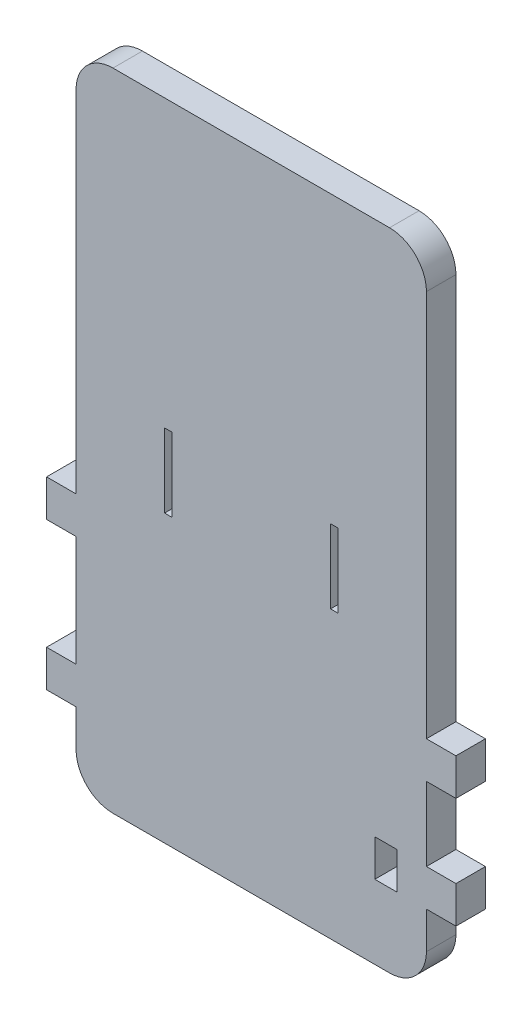
ISO-10303-21;
HEADER;
FILE_DESCRIPTION(('STEP AP214'),'2;1');
FILE_NAME('part.step','',(''),(''),'','','');
FILE_SCHEMA(('AUTOMOTIVE_DESIGN { 1 0 10303 214 1 1 1 1 }'));
ENDSEC;
DATA;
#1=APPLICATION_CONTEXT('core data for automotive mechanical design processes');
#2=APPLICATION_PROTOCOL_DEFINITION('international standard','automotive_design',2000,#1);
#3=PRODUCT_CONTEXT('',#1,'mechanical');
#4=PRODUCT('Part','Part','',(#3));
#5=PRODUCT_RELATED_PRODUCT_CATEGORY('part','',(#4));
#6=PRODUCT_DEFINITION_FORMATION('','',#4);
#7=PRODUCT_DEFINITION_CONTEXT('part definition',#1,'design');
#8=PRODUCT_DEFINITION('design','',#6,#7);
#9=PRODUCT_DEFINITION_SHAPE('','',#8);
#10=(LENGTH_UNIT() NAMED_UNIT(*) SI_UNIT(.MILLI.,.METRE.));
#11=(NAMED_UNIT(*) PLANE_ANGLE_UNIT() SI_UNIT($,.RADIAN.));
#12=(NAMED_UNIT(*) SI_UNIT($,.STERADIAN.) SOLID_ANGLE_UNIT());
#13=UNCERTAINTY_MEASURE_WITH_UNIT(LENGTH_MEASURE(1.E-05),#10,'distance_accuracy_value','');
#14=(GEOMETRIC_REPRESENTATION_CONTEXT(3) GLOBAL_UNCERTAINTY_ASSIGNED_CONTEXT((#13)) GLOBAL_UNIT_ASSIGNED_CONTEXT((#10,
#11,#12)) REPRESENTATION_CONTEXT('',''));
#15=CARTESIAN_POINT('',(0.,0.,0.));
#16=DIRECTION('',(0.,0.,1.));
#17=DIRECTION('',(1.,0.,0.));
#18=AXIS2_PLACEMENT_3D('',#15,#16,#17);
#19=CARTESIAN_POINT('',(47.5,0.,8.));
#20=DIRECTION('',(-1.,0.,0.));
#21=DIRECTION('',(0.,0.,1.));
#22=AXIS2_PLACEMENT_3D('',#19,#20,#21);
#23=PLANE('',#22);
#24=DIRECTION('',(0.,0.,-1.));
#25=VECTOR('',#24,1.);
#26=CARTESIAN_POINT('',(47.5,-37.5,8.0000000000001));
#27=LINE('',#26,#25);
#28=CARTESIAN_POINT('',(47.5,-37.5,8.));
#29=VERTEX_POINT('',#28);
#30=CARTESIAN_POINT('',(47.5,-37.5,0.));
#31=VERTEX_POINT('',#30);
#32=EDGE_CURVE('E60',#29,#31,#27,.T.);
#33=ORIENTED_EDGE('',*,*,#32,.F.);
#34=DIRECTION('',(0.,1.,0.));
#35=VECTOR('',#34,1.);
#36=CARTESIAN_POINT('',(47.5,0.,8.));
#37=LINE('',#36,#35);
#38=CARTESIAN_POINT('',(47.5,-57.5,8.));
#39=VERTEX_POINT('',#38);
#40=EDGE_CURVE('E295',#39,#29,#37,.T.);
#41=ORIENTED_EDGE('',*,*,#40,.F.);
#42=DIRECTION('',(0.,0.,1.));
#43=VECTOR('',#42,1.);
#44=CARTESIAN_POINT('',(47.5,-57.5,8.));
#45=LINE('',#44,#43);
#46=CARTESIAN_POINT('',(47.5,-57.5,0.));
#47=VERTEX_POINT('',#46);
#48=EDGE_CURVE('E299',#47,#39,#45,.T.);
#49=ORIENTED_EDGE('',*,*,#48,.F.);
#50=DIRECTION('',(0.,1.,0.));
#51=VECTOR('',#50,1.);
#52=CARTESIAN_POINT('',(47.5,0.,0.));
#53=LINE('',#52,#51);
#54=EDGE_CURVE('E457',#47,#31,#53,.T.);
#55=ORIENTED_EDGE('',*,*,#54,.T.);
#56=EDGE_LOOP('',(#33,#41,#49,#55));
#57=FACE_BOUND('',#56,.T.);
#58=ADVANCED_FACE('F35',(#57),#23,.F.);
#59=DIRECTION('',(0.,0.,1.));
#60=VECTOR('',#59,1.);
#61=CARTESIAN_POINT('',(47.5,-27.5,8.0000000000001));
#62=LINE('',#61,#60);
#63=CARTESIAN_POINT('',(47.5,-27.5,1.04744440165294E-13));
#64=VERTEX_POINT('',#63);
#65=CARTESIAN_POINT('',(47.5,-27.5,8.));
#66=VERTEX_POINT('',#65);
#67=EDGE_CURVE('E289',#64,#66,#62,.T.);
#68=ORIENTED_EDGE('',*,*,#67,.F.);
#69=CARTESIAN_POINT('',(47.5,77.4999999999999,0.));
#70=VERTEX_POINT('',#69);
#71=EDGE_CURVE('E453',#64,#70,#53,.T.);
#72=ORIENTED_EDGE('',*,*,#71,.T.);
#73=DIRECTION('',(0.,0.,-1.));
#74=VECTOR('',#73,1.);
#75=CARTESIAN_POINT('',(47.5,77.4999999999999,8.));
#76=LINE('',#75,#74);
#77=CARTESIAN_POINT('',(47.5,77.4999999999999,8.));
#78=VERTEX_POINT('',#77);
#79=EDGE_CURVE('E432',#78,#70,#76,.T.);
#80=ORIENTED_EDGE('',*,*,#79,.F.);
#81=EDGE_CURVE('E52',#66,#78,#37,.T.);
#82=ORIENTED_EDGE('',*,*,#81,.F.);
#83=EDGE_LOOP('',(#68,#72,#80,#82));
#84=FACE_BOUND('',#83,.T.);
#85=ADVANCED_FACE('F550',(#84),#23,.F.);
#86=DIRECTION('',(0.,0.,-1.));
#87=VECTOR('',#86,1.);
#88=CARTESIAN_POINT('',(47.5,-67.5,8.));
#89=LINE('',#88,#87);
#90=CARTESIAN_POINT('',(47.5,-67.5,8.));
#91=VERTEX_POINT('',#90);
#92=CARTESIAN_POINT('',(47.5,-67.5,0.));
#93=VERTEX_POINT('',#92);
#94=EDGE_CURVE('E296',#91,#93,#89,.T.);
#95=ORIENTED_EDGE('',*,*,#94,.F.);
#96=CARTESIAN_POINT('',(47.5,-77.4999999999999,8.));
#97=VERTEX_POINT('',#96);
#98=EDGE_CURVE('E396',#97,#91,#37,.T.);
#99=ORIENTED_EDGE('',*,*,#98,.F.);
#100=DIRECTION('',(0.,0.,-1.));
#101=VECTOR('',#100,1.);
#102=CARTESIAN_POINT('',(47.5,-77.4999999999999,8.));
#103=LINE('',#102,#101);
#104=CARTESIAN_POINT('',(47.5,-77.4999999999999,0.));
#105=VERTEX_POINT('',#104);
#106=EDGE_CURVE('E518',#97,#105,#103,.T.);
#107=ORIENTED_EDGE('',*,*,#106,.T.);
#108=EDGE_CURVE('E454',#105,#93,#53,.T.);
#109=ORIENTED_EDGE('',*,*,#108,.T.);
#110=EDGE_LOOP('',(#95,#99,#107,#109));
#111=FACE_BOUND('',#110,.T.);
#112=ADVANCED_FACE('F573',(#111),#23,.F.);
#113=CARTESIAN_POINT('',(-47.5,0.,8.));
#114=DIRECTION('',(-1.,0.,0.));
#115=DIRECTION('',(0.,0.,1.));
#116=AXIS2_PLACEMENT_3D('',#113,#114,#115);
#117=PLANE('',#116);
#118=DIRECTION('',(0.,1.,0.));
#119=VECTOR('',#118,1.);
#120=CARTESIAN_POINT('',(-47.5,0.,8.));
#121=LINE('',#120,#119);
#122=CARTESIAN_POINT('',(-47.5,-57.5,8.00000000000002));
#123=VERTEX_POINT('',#122);
#124=CARTESIAN_POINT('',(-47.5,-27.5,8.));
#125=VERTEX_POINT('',#124);
#126=EDGE_CURVE('E389',#123,#125,#121,.T.);
#127=ORIENTED_EDGE('',*,*,#126,.T.);
#128=DIRECTION('',(0.,0.,1.));
#129=VECTOR('',#128,1.);
#130=CARTESIAN_POINT('',(-47.5,-27.5,0.));
#131=LINE('',#130,#129);
#132=CARTESIAN_POINT('',(-47.5,-27.5,0.));
#133=VERTEX_POINT('',#132);
#134=EDGE_CURVE('E327',#133,#125,#131,.T.);
#135=ORIENTED_EDGE('',*,*,#134,.F.);
#136=DIRECTION('',(0.,1.,0.));
#137=VECTOR('',#136,1.);
#138=CARTESIAN_POINT('',(-47.5,0.,0.));
#139=LINE('',#138,#137);
#140=CARTESIAN_POINT('',(-47.5,-57.5,0.));
#141=VERTEX_POINT('',#140);
#142=EDGE_CURVE('E446',#141,#133,#139,.T.);
#143=ORIENTED_EDGE('',*,*,#142,.F.);
#144=DIRECTION('',(0.,0.,-1.));
#145=VECTOR('',#144,1.);
#146=CARTESIAN_POINT('',(-47.5,-57.5,0.));
#147=LINE('',#146,#145);
#148=EDGE_CURVE('E355',#123,#141,#147,.T.);
#149=ORIENTED_EDGE('',*,*,#148,.F.);
#150=EDGE_LOOP('',(#127,#135,#143,#149));
#151=FACE_BOUND('',#150,.T.);
#152=ADVANCED_FACE('F580',(#151),#117,.T.);
#153=CARTESIAN_POINT('',(-47.5,-17.5,0.));
#154=VERTEX_POINT('',#153);
#155=CARTESIAN_POINT('',(-47.5,77.4999999999999,0.));
#156=VERTEX_POINT('',#155);
#157=EDGE_CURVE('E441',#154,#156,#139,.T.);
#158=ORIENTED_EDGE('',*,*,#157,.F.);
#159=DIRECTION('',(0.,0.,-1.));
#160=VECTOR('',#159,1.);
#161=CARTESIAN_POINT('',(-47.5,-17.5,0.));
#162=LINE('',#161,#160);
#163=CARTESIAN_POINT('',(-47.5,-17.5,8.));
#164=VERTEX_POINT('',#163);
#165=EDGE_CURVE('E332',#164,#154,#162,.T.);
#166=ORIENTED_EDGE('',*,*,#165,.F.);
#167=CARTESIAN_POINT('',(-47.5,77.4999999999999,8.));
#168=VERTEX_POINT('',#167);
#169=EDGE_CURVE('E384',#164,#168,#121,.T.);
#170=ORIENTED_EDGE('',*,*,#169,.T.);
#171=DIRECTION('',(0.,0.,-1.));
#172=VECTOR('',#171,1.);
#173=CARTESIAN_POINT('',(-47.5,77.4999999999999,8.));
#174=LINE('',#173,#172);
#175=EDGE_CURVE('E528',#168,#156,#174,.T.);
#176=ORIENTED_EDGE('',*,*,#175,.T.);
#177=EDGE_LOOP('',(#158,#166,#170,#176));
#178=FACE_BOUND('',#177,.T.);
#179=ADVANCED_FACE('F585',(#178),#117,.T.);
#180=CARTESIAN_POINT('',(-47.5,-77.4999999999999,8.));
#181=VERTEX_POINT('',#180);
#182=CARTESIAN_POINT('',(-47.5,-67.5,8.));
#183=VERTEX_POINT('',#182);
#184=EDGE_CURVE('E385',#181,#183,#121,.T.);
#185=ORIENTED_EDGE('',*,*,#184,.T.);
#186=DIRECTION('',(0.,0.,1.));
#187=VECTOR('',#186,1.);
#188=CARTESIAN_POINT('',(-47.5,-67.5,0.));
#189=LINE('',#188,#187);
#190=CARTESIAN_POINT('',(-47.5,-67.5,0.));
#191=VERTEX_POINT('',#190);
#192=EDGE_CURVE('E350',#191,#183,#189,.T.);
#193=ORIENTED_EDGE('',*,*,#192,.F.);
#194=CARTESIAN_POINT('',(-47.5,-77.4999999999999,0.));
#195=VERTEX_POINT('',#194);
#196=EDGE_CURVE('E442',#195,#191,#139,.T.);
#197=ORIENTED_EDGE('',*,*,#196,.F.);
#198=DIRECTION('',(0.,0.,-1.));
#199=VECTOR('',#198,1.);
#200=CARTESIAN_POINT('',(-47.5,-77.4999999999999,8.));
#201=LINE('',#200,#199);
#202=EDGE_CURVE('E526',#181,#195,#201,.T.);
#203=ORIENTED_EDGE('',*,*,#202,.F.);
#204=EDGE_LOOP('',(#185,#193,#197,#203));
#205=FACE_BOUND('',#204,.T.);
#206=ADVANCED_FACE('F588',(#205),#117,.T.);
#207=CARTESIAN_POINT('',(23.5,0.,8.));
#208=DIRECTION('',(-1.,0.,0.));
#209=DIRECTION('',(0.,0.,1.));
#210=AXIS2_PLACEMENT_3D('',#207,#208,#209);
#211=PLANE('',#210);
#212=DIRECTION('',(0.,1.,0.));
#213=VECTOR('',#212,1.);
#214=CARTESIAN_POINT('',(23.5,0.,0.));
#215=LINE('',#214,#213);
#216=CARTESIAN_POINT('',(23.5,-9.99999999999998,0.));
#217=VERTEX_POINT('',#216);
#218=CARTESIAN_POINT('',(23.5,10.,0.));
#219=VERTEX_POINT('',#218);
#220=EDGE_CURVE('E481',#217,#219,#215,.T.);
#221=ORIENTED_EDGE('',*,*,#220,.F.);
#222=DIRECTION('',(0.,0.,-1.));
#223=VECTOR('',#222,1.);
#224=CARTESIAN_POINT('',(23.5,-9.99999999999998,8.));
#225=LINE('',#224,#223);
#226=CARTESIAN_POINT('',(23.5,-9.99999999999998,8.));
#227=VERTEX_POINT('',#226);
#228=EDGE_CURVE('E11',#227,#217,#225,.T.);
#229=ORIENTED_EDGE('',*,*,#228,.F.);
#230=DIRECTION('',(0.,1.,0.));
#231=VECTOR('',#230,1.);
#232=CARTESIAN_POINT('',(23.5,0.,8.));
#233=LINE('',#232,#231);
#234=CARTESIAN_POINT('',(23.5,10.,8.));
#235=VERTEX_POINT('',#234);
#236=EDGE_CURVE('E421',#227,#235,#233,.T.);
#237=ORIENTED_EDGE('',*,*,#236,.T.);
#238=DIRECTION('',(0.,0.,-1.));
#239=VECTOR('',#238,1.);
#240=CARTESIAN_POINT('',(23.5,10.,8.));
#241=LINE('',#240,#239);
#242=EDGE_CURVE('E492',#235,#219,#241,.T.);
#243=ORIENTED_EDGE('',*,*,#242,.T.);
#244=EDGE_LOOP('',(#221,#229,#237,#243));
#245=FACE_BOUND('',#244,.T.);
#246=ADVANCED_FACE('F656',(#245),#211,.T.);
#247=CARTESIAN_POINT('',(0.,-9.99999999999998,8.));
#248=DIRECTION('',(0.,1.,0.));
#249=DIRECTION('',(0.,0.,1.));
#250=AXIS2_PLACEMENT_3D('',#247,#248,#249);
#251=PLANE('',#250);
#252=DIRECTION('',(1.,0.,0.));
#253=VECTOR('',#252,1.);
#254=CARTESIAN_POINT('',(0.,-9.99999999999998,0.));
#255=LINE('',#254,#253);
#256=CARTESIAN_POINT('',(21.5,-9.99999999999998,0.));
#257=VERTEX_POINT('',#256);
#258=EDGE_CURVE('E484',#257,#217,#255,.T.);
#259=ORIENTED_EDGE('',*,*,#258,.F.);
#260=DIRECTION('',(0.,0.,-1.));
#261=VECTOR('',#260,1.);
#262=CARTESIAN_POINT('',(21.5,-9.99999999999998,8.));
#263=LINE('',#262,#261);
#264=CARTESIAN_POINT('',(21.5,-9.99999999999998,8.));
#265=VERTEX_POINT('',#264);
#266=EDGE_CURVE('E44',#265,#257,#263,.T.);
#267=ORIENTED_EDGE('',*,*,#266,.F.);
#268=DIRECTION('',(1.,0.,0.));
#269=VECTOR('',#268,1.);
#270=CARTESIAN_POINT('',(0.,-9.99999999999998,8.));
#271=LINE('',#270,#269);
#272=EDGE_CURVE('E424',#265,#227,#271,.T.);
#273=ORIENTED_EDGE('',*,*,#272,.T.);
#274=ORIENTED_EDGE('',*,*,#228,.T.);
#275=EDGE_LOOP('',(#259,#267,#273,#274));
#276=FACE_BOUND('',#275,.T.);
#277=ADVANCED_FACE('F728',(#276),#251,.T.);
#278=CARTESIAN_POINT('',(21.5,0.,8.));
#279=DIRECTION('',(-1.,0.,0.));
#280=DIRECTION('',(0.,0.,1.));
#281=AXIS2_PLACEMENT_3D('',#278,#279,#280);
#282=PLANE('',#281);
#283=DIRECTION('',(0.,1.,0.));
#284=VECTOR('',#283,1.);
#285=CARTESIAN_POINT('',(21.5,0.,0.));
#286=LINE('',#285,#284);
#287=CARTESIAN_POINT('',(21.5,10.,0.));
#288=VERTEX_POINT('',#287);
#289=EDGE_CURVE('E487',#257,#288,#286,.T.);
#290=ORIENTED_EDGE('',*,*,#289,.T.);
#291=DIRECTION('',(0.,0.,-1.));
#292=VECTOR('',#291,1.);
#293=CARTESIAN_POINT('',(21.5,10.,8.));
#294=LINE('',#293,#292);
#295=CARTESIAN_POINT('',(21.5,10.,8.));
#296=VERTEX_POINT('',#295);
#297=EDGE_CURVE('E494',#296,#288,#294,.T.);
#298=ORIENTED_EDGE('',*,*,#297,.F.);
#299=DIRECTION('',(0.,1.,0.));
#300=VECTOR('',#299,1.);
#301=CARTESIAN_POINT('',(21.5,0.,8.));
#302=LINE('',#301,#300);
#303=EDGE_CURVE('E427',#265,#296,#302,.T.);
#304=ORIENTED_EDGE('',*,*,#303,.F.);
#305=ORIENTED_EDGE('',*,*,#266,.T.);
#306=EDGE_LOOP('',(#290,#298,#304,#305));
#307=FACE_BOUND('',#306,.T.);
#308=ADVANCED_FACE('F723',(#307),#282,.F.);
#309=CARTESIAN_POINT('',(-21.5,0.,8.));
#310=DIRECTION('',(-1.,0.,0.));
#311=DIRECTION('',(0.,-1.,0.));
#312=AXIS2_PLACEMENT_3D('',#309,#310,#311);
#313=PLANE('',#312);
#314=DIRECTION('',(0.,1.,0.));
#315=VECTOR('',#314,1.);
#316=CARTESIAN_POINT('',(-21.5,0.,0.));
#317=LINE('',#316,#315);
#318=CARTESIAN_POINT('',(-21.5,-9.99999999999999,0.));
#319=VERTEX_POINT('',#318);
#320=CARTESIAN_POINT('',(-21.5,10.,0.));
#321=VERTEX_POINT('',#320);
#322=EDGE_CURVE('E469',#319,#321,#317,.T.);
#323=ORIENTED_EDGE('',*,*,#322,.F.);
#324=DIRECTION('',(0.,0.,-1.));
#325=VECTOR('',#324,1.);
#326=CARTESIAN_POINT('',(-21.5,-9.99999999999999,8.));
#327=LINE('',#326,#325);
#328=CARTESIAN_POINT('',(-21.5,-9.99999999999999,8.));
#329=VERTEX_POINT('',#328);
#330=EDGE_CURVE('E495',#329,#319,#327,.T.);
#331=ORIENTED_EDGE('',*,*,#330,.F.);
#332=DIRECTION('',(0.,1.,0.));
#333=VECTOR('',#332,1.);
#334=CARTESIAN_POINT('',(-21.5,0.,8.));
#335=LINE('',#334,#333);
#336=CARTESIAN_POINT('',(-21.5,10.,8.));
#337=VERTEX_POINT('',#336);
#338=EDGE_CURVE('E410',#329,#337,#335,.T.);
#339=ORIENTED_EDGE('',*,*,#338,.T.);
#340=DIRECTION('',(0.,0.,-1.));
#341=VECTOR('',#340,1.);
#342=CARTESIAN_POINT('',(-21.5,10.,8.));
#343=LINE('',#342,#341);
#344=EDGE_CURVE('E499',#337,#321,#343,.T.);
#345=ORIENTED_EDGE('',*,*,#344,.T.);
#346=EDGE_LOOP('',(#323,#331,#339,#345));
#347=FACE_BOUND('',#346,.T.);
#348=ADVANCED_FACE('F720',(#347),#313,.T.);
#349=CARTESIAN_POINT('',(0.,-9.99999999999999,8.));
#350=DIRECTION('',(0.,-1.,0.));
#351=DIRECTION('',(0.,0.,-1.));
#352=AXIS2_PLACEMENT_3D('',#349,#350,#351);
#353=PLANE('',#352);
#354=DIRECTION('',(-1.,0.,0.));
#355=VECTOR('',#354,1.);
#356=CARTESIAN_POINT('',(0.,-9.99999999999999,0.));
#357=LINE('',#356,#355);
#358=CARTESIAN_POINT('',(-23.5,-9.99999999999999,0.));
#359=VERTEX_POINT('',#358);
#360=EDGE_CURVE('E472',#319,#359,#357,.T.);
#361=ORIENTED_EDGE('',*,*,#360,.T.);
#362=DIRECTION('',(0.,0.,-1.));
#363=VECTOR('',#362,1.);
#364=CARTESIAN_POINT('',(-23.5,-9.99999999999999,8.));
#365=LINE('',#364,#363);
#366=CARTESIAN_POINT('',(-23.5,-9.99999999999999,8.));
#367=VERTEX_POINT('',#366);
#368=EDGE_CURVE('E504',#367,#359,#365,.T.);
#369=ORIENTED_EDGE('',*,*,#368,.F.);
#370=DIRECTION('',(-1.,0.,0.));
#371=VECTOR('',#370,1.);
#372=CARTESIAN_POINT('',(0.,-9.99999999999999,8.));
#373=LINE('',#372,#371);
#374=EDGE_CURVE('E413',#329,#367,#373,.T.);
#375=ORIENTED_EDGE('',*,*,#374,.F.);
#376=ORIENTED_EDGE('',*,*,#330,.T.);
#377=EDGE_LOOP('',(#361,#369,#375,#376));
#378=FACE_BOUND('',#377,.T.);
#379=ADVANCED_FACE('F687',(#378),#353,.F.);
#380=CARTESIAN_POINT('',(-23.5,0.,8.));
#381=DIRECTION('',(-1.,0.,0.));
#382=DIRECTION('',(0.,-1.,0.));
#383=AXIS2_PLACEMENT_3D('',#380,#381,#382);
#384=PLANE('',#383);
#385=DIRECTION('',(0.,1.,0.));
#386=VECTOR('',#385,1.);
#387=CARTESIAN_POINT('',(-23.5,0.,0.));
#388=LINE('',#387,#386);
#389=CARTESIAN_POINT('',(-23.5,10.,0.));
#390=VERTEX_POINT('',#389);
#391=EDGE_CURVE('E475',#359,#390,#388,.T.);
#392=ORIENTED_EDGE('',*,*,#391,.T.);
#393=DIRECTION('',(0.,0.,-1.));
#394=VECTOR('',#393,1.);
#395=CARTESIAN_POINT('',(-23.5,10.,8.));
#396=LINE('',#395,#394);
#397=CARTESIAN_POINT('',(-23.5,10.,8.));
#398=VERTEX_POINT('',#397);
#399=EDGE_CURVE('E501',#398,#390,#396,.T.);
#400=ORIENTED_EDGE('',*,*,#399,.F.);
#401=DIRECTION('',(0.,1.,0.));
#402=VECTOR('',#401,1.);
#403=CARTESIAN_POINT('',(-23.5,0.,8.));
#404=LINE('',#403,#402);
#405=EDGE_CURVE('E416',#367,#398,#404,.T.);
#406=ORIENTED_EDGE('',*,*,#405,.F.);
#407=ORIENTED_EDGE('',*,*,#368,.T.);
#408=EDGE_LOOP('',(#392,#400,#406,#407));
#409=FACE_BOUND('',#408,.T.);
#410=ADVANCED_FACE('F682',(#409),#384,.F.);
#411=CARTESIAN_POINT('',(39.5,0.,8.));
#412=DIRECTION('',(-1.,0.,0.));
#413=DIRECTION('',(0.,0.,1.));
#414=AXIS2_PLACEMENT_3D('',#411,#412,#413);
#415=PLANE('',#414);
#416=DIRECTION('',(0.,1.,0.));
#417=VECTOR('',#416,1.);
#418=CARTESIAN_POINT('',(39.5,0.,0.));
#419=LINE('',#418,#417);
#420=CARTESIAN_POINT('',(39.5,-67.5,0.));
#421=VERTEX_POINT('',#420);
#422=CARTESIAN_POINT('',(39.5,-57.5,0.));
#423=VERTEX_POINT('',#422);
#424=EDGE_CURVE('E456',#421,#423,#419,.T.);
#425=ORIENTED_EDGE('',*,*,#424,.F.);
#426=DIRECTION('',(0.,0.,-1.));
#427=VECTOR('',#426,1.);
#428=CARTESIAN_POINT('',(39.5,-67.5,8.));
#429=LINE('',#428,#427);
#430=CARTESIAN_POINT('',(39.5,-67.5,8.));
#431=VERTEX_POINT('',#430);
#432=EDGE_CURVE('E502',#431,#421,#429,.T.);
#433=ORIENTED_EDGE('',*,*,#432,.F.);
#434=DIRECTION('',(0.,1.,0.));
#435=VECTOR('',#434,1.);
#436=CARTESIAN_POINT('',(39.5,0.,8.));
#437=LINE('',#436,#435);
#438=CARTESIAN_POINT('',(39.5,-57.5,8.));
#439=VERTEX_POINT('',#438);
#440=EDGE_CURVE('E399',#431,#439,#437,.T.);
#441=ORIENTED_EDGE('',*,*,#440,.T.);
#442=DIRECTION('',(0.,0.,-1.));
#443=VECTOR('',#442,1.);
#444=CARTESIAN_POINT('',(39.5,-57.5,8.));
#445=LINE('',#444,#443);
#446=EDGE_CURVE('E508',#439,#423,#445,.T.);
#447=ORIENTED_EDGE('',*,*,#446,.T.);
#448=EDGE_LOOP('',(#425,#433,#441,#447));
#449=FACE_BOUND('',#448,.T.);
#450=ADVANCED_FACE('F675',(#449),#415,.T.);
#451=CARTESIAN_POINT('',(0.,-67.5,8.));
#452=DIRECTION('',(0.,1.,0.));
#453=DIRECTION('',(0.,0.,1.));
#454=AXIS2_PLACEMENT_3D('',#451,#452,#453);
#455=PLANE('',#454);
#456=DIRECTION('',(1.,0.,0.));
#457=VECTOR('',#456,1.);
#458=CARTESIAN_POINT('',(0.,-67.5,0.));
#459=LINE('',#458,#457);
#460=CARTESIAN_POINT('',(33.5,-67.5,0.));
#461=VERTEX_POINT('',#460);
#462=EDGE_CURVE('E460',#461,#421,#459,.T.);
#463=ORIENTED_EDGE('',*,*,#462,.F.);
#464=DIRECTION('',(0.,0.,-1.));
#465=VECTOR('',#464,1.);
#466=CARTESIAN_POINT('',(33.5,-67.5,8.));
#467=LINE('',#466,#465);
#468=CARTESIAN_POINT('',(33.5,-67.5,8.));
#469=VERTEX_POINT('',#468);
#470=EDGE_CURVE('E513',#469,#461,#467,.T.);
#471=ORIENTED_EDGE('',*,*,#470,.F.);
#472=DIRECTION('',(1.,0.,0.));
#473=VECTOR('',#472,1.);
#474=CARTESIAN_POINT('',(0.,-67.5,8.));
#475=LINE('',#474,#473);
#476=EDGE_CURVE('E402',#469,#431,#475,.T.);
#477=ORIENTED_EDGE('',*,*,#476,.T.);
#478=ORIENTED_EDGE('',*,*,#432,.T.);
#479=EDGE_LOOP('',(#463,#471,#477,#478));
#480=FACE_BOUND('',#479,.T.);
#481=ADVANCED_FACE('F669',(#480),#455,.T.);
#482=CARTESIAN_POINT('',(33.5,0.,8.));
#483=DIRECTION('',(-1.,0.,0.));
#484=DIRECTION('',(0.,0.,1.));
#485=AXIS2_PLACEMENT_3D('',#482,#483,#484);
#486=PLANE('',#485);
#487=DIRECTION('',(0.,1.,0.));
#488=VECTOR('',#487,1.);
#489=CARTESIAN_POINT('',(33.5,0.,0.));
#490=LINE('',#489,#488);
#491=CARTESIAN_POINT('',(33.5,-57.5,0.));
#492=VERTEX_POINT('',#491);
#493=EDGE_CURVE('E463',#461,#492,#490,.T.);
#494=ORIENTED_EDGE('',*,*,#493,.T.);
#495=DIRECTION('',(0.,0.,-1.));
#496=VECTOR('',#495,1.);
#497=CARTESIAN_POINT('',(33.5,-57.5,8.));
#498=LINE('',#497,#496);
#499=CARTESIAN_POINT('',(33.5,-57.5,8.));
#500=VERTEX_POINT('',#499);
#501=EDGE_CURVE('E510',#500,#492,#498,.T.);
#502=ORIENTED_EDGE('',*,*,#501,.F.);
#503=DIRECTION('',(0.,1.,0.));
#504=VECTOR('',#503,1.);
#505=CARTESIAN_POINT('',(33.5,0.,8.));
#506=LINE('',#505,#504);
#507=EDGE_CURVE('E405',#469,#500,#506,.T.);
#508=ORIENTED_EDGE('',*,*,#507,.F.);
#509=ORIENTED_EDGE('',*,*,#470,.T.);
#510=EDGE_LOOP('',(#494,#502,#508,#509));
#511=FACE_BOUND('',#510,.T.);
#512=ADVANCED_FACE('F665',(#511),#486,.F.);
#513=CARTESIAN_POINT('',(37.5,77.5,8.));
#514=DIRECTION('',(0.,0.,-1.));
#515=DIRECTION('',(-1.,0.,0.));
#516=AXIS2_PLACEMENT_3D('',#513,#514,#515);
#517=CYLINDRICAL_SURFACE('',#516,10.);
#518=CARTESIAN_POINT('',(37.5,77.5,0.));
#519=DIRECTION('',(0.,0.,1.));
#520=DIRECTION('',(1.,0.,0.));
#521=AXIS2_PLACEMENT_3D('',#518,#519,#520);
#522=CIRCLE('',#521,10.);
#523=CARTESIAN_POINT('',(37.4999999999999,87.5,0.));
#524=VERTEX_POINT('',#523);
#525=EDGE_CURVE('E373',#524,#70,#522,.F.);
#526=ORIENTED_EDGE('',*,*,#525,.F.);
#527=DIRECTION('',(0.,0.,-1.));
#528=VECTOR('',#527,1.);
#529=CARTESIAN_POINT('',(37.4999999999999,87.5,8.));
#530=LINE('',#529,#528);
#531=CARTESIAN_POINT('',(37.4999999999999,87.5,8.));
#532=VERTEX_POINT('',#531);
#533=EDGE_CURVE('E39',#532,#524,#530,.T.);
#534=ORIENTED_EDGE('',*,*,#533,.F.);
#535=CARTESIAN_POINT('',(37.5,77.5,8.));
#536=DIRECTION('',(0.,0.,1.));
#537=DIRECTION('',(1.,0.,0.));
#538=AXIS2_PLACEMENT_3D('',#535,#536,#537);
#539=CIRCLE('',#538,10.);
#540=EDGE_CURVE('E374',#532,#78,#539,.F.);
#541=ORIENTED_EDGE('',*,*,#540,.T.);
#542=ORIENTED_EDGE('',*,*,#79,.T.);
#543=EDGE_LOOP('',(#526,#534,#541,#542));
#544=FACE_BOUND('',#543,.T.);
#545=ADVANCED_FACE('F37',(#544),#517,.T.);
#546=CARTESIAN_POINT('',(0.,87.5,8.));
#547=DIRECTION('',(0.,1.,0.));
#548=DIRECTION('',(0.,0.,1.));
#549=AXIS2_PLACEMENT_3D('',#546,#547,#548);
#550=PLANE('',#549);
#551=DIRECTION('',(1.,0.,0.));
#552=VECTOR('',#551,1.);
#553=CARTESIAN_POINT('',(0.,87.5,0.));
#554=LINE('',#553,#552);
#555=CARTESIAN_POINT('',(-37.4999999999999,87.5,0.));
#556=VERTEX_POINT('',#555);
#557=EDGE_CURVE('E435',#556,#524,#554,.T.);
#558=ORIENTED_EDGE('',*,*,#557,.F.);
#559=DIRECTION('',(0.,0.,-1.));
#560=VECTOR('',#559,1.);
#561=CARTESIAN_POINT('',(-37.4999999999999,87.5,8.));
#562=LINE('',#561,#560);
#563=CARTESIAN_POINT('',(-37.4999999999999,87.5,8.));
#564=VERTEX_POINT('',#563);
#565=EDGE_CURVE('E530',#564,#556,#562,.T.);
#566=ORIENTED_EDGE('',*,*,#565,.F.);
#567=DIRECTION('',(1.,0.,0.));
#568=VECTOR('',#567,1.);
#569=CARTESIAN_POINT('',(0.,87.5,8.));
#570=LINE('',#569,#568);
#571=EDGE_CURVE('E377',#564,#532,#570,.T.);
#572=ORIENTED_EDGE('',*,*,#571,.T.);
#573=ORIENTED_EDGE('',*,*,#533,.T.);
#574=EDGE_LOOP('',(#558,#566,#572,#573));
#575=FACE_BOUND('',#574,.T.);
#576=ADVANCED_FACE('F536',(#575),#550,.T.);
#577=CARTESIAN_POINT('',(-37.5,77.5,8.));
#578=DIRECTION('',(0.,0.,-1.));
#579=DIRECTION('',(-1.,0.,0.));
#580=AXIS2_PLACEMENT_3D('',#577,#578,#579);
#581=CYLINDRICAL_SURFACE('',#580,10.);
#582=CARTESIAN_POINT('',(-37.5,77.5,0.));
#583=DIRECTION('',(0.,0.,1.));
#584=DIRECTION('',(1.,0.,0.));
#585=AXIS2_PLACEMENT_3D('',#582,#583,#584);
#586=CIRCLE('',#585,10.);
#587=EDGE_CURVE('E438',#156,#556,#586,.F.);
#588=ORIENTED_EDGE('',*,*,#587,.F.);
#589=ORIENTED_EDGE('',*,*,#175,.F.);
#590=CARTESIAN_POINT('',(-37.5,77.5,8.));
#591=DIRECTION('',(0.,0.,1.));
#592=DIRECTION('',(1.,0.,0.));
#593=AXIS2_PLACEMENT_3D('',#590,#591,#592);
#594=CIRCLE('',#593,10.);
#595=EDGE_CURVE('E381',#168,#564,#594,.F.);
#596=ORIENTED_EDGE('',*,*,#595,.T.);
#597=ORIENTED_EDGE('',*,*,#565,.T.);
#598=EDGE_LOOP('',(#588,#589,#596,#597));
#599=FACE_BOUND('',#598,.T.);
#600=ADVANCED_FACE('F544',(#599),#581,.T.);
#601=CARTESIAN_POINT('',(-37.5,-77.5,8.));
#602=DIRECTION('',(0.,0.,-1.));
#603=DIRECTION('',(-1.,0.,0.));
#604=AXIS2_PLACEMENT_3D('',#601,#602,#603);
#605=CYLINDRICAL_SURFACE('',#604,10.);
#606=CARTESIAN_POINT('',(-37.5,-77.5,0.));
#607=DIRECTION('',(0.,0.,1.));
#608=DIRECTION('',(1.,0.,0.));
#609=AXIS2_PLACEMENT_3D('',#606,#607,#608);
#610=CIRCLE('',#609,10.);
#611=CARTESIAN_POINT('',(-37.4999999999999,-87.5,0.));
#612=VERTEX_POINT('',#611);
#613=EDGE_CURVE('E445',#612,#195,#610,.F.);
#614=ORIENTED_EDGE('',*,*,#613,.F.);
#615=DIRECTION('',(0.,0.,-1.));
#616=VECTOR('',#615,1.);
#617=CARTESIAN_POINT('',(-37.4999999999999,-87.5,8.));
#618=LINE('',#617,#616);
#619=CARTESIAN_POINT('',(-37.4999999999999,-87.5,8.));
#620=VERTEX_POINT('',#619);
#621=EDGE_CURVE('E524',#620,#612,#618,.T.);
#622=ORIENTED_EDGE('',*,*,#621,.F.);
#623=CARTESIAN_POINT('',(-37.5,-77.5,8.));
#624=DIRECTION('',(0.,0.,1.));
#625=DIRECTION('',(1.,0.,0.));
#626=AXIS2_PLACEMENT_3D('',#623,#624,#625);
#627=CIRCLE('',#626,10.);
#628=EDGE_CURVE('E388',#620,#181,#627,.F.);
#629=ORIENTED_EDGE('',*,*,#628,.T.);
#630=ORIENTED_EDGE('',*,*,#202,.T.);
#631=EDGE_LOOP('',(#614,#622,#629,#630));
#632=FACE_BOUND('',#631,.T.);
#633=ADVANCED_FACE('F615',(#632),#605,.T.);
#634=CARTESIAN_POINT('',(0.,-87.5,8.));
#635=DIRECTION('',(0.,1.,0.));
#636=DIRECTION('',(0.,0.,1.));
#637=AXIS2_PLACEMENT_3D('',#634,#635,#636);
#638=PLANE('',#637);
#639=DIRECTION('',(1.,0.,0.));
#640=VECTOR('',#639,1.);
#641=CARTESIAN_POINT('',(0.,-87.5,0.));
#642=LINE('',#641,#640);
#643=CARTESIAN_POINT('',(37.4999999999999,-87.5,0.));
#644=VERTEX_POINT('',#643);
#645=EDGE_CURVE('E449',#612,#644,#642,.T.);
#646=ORIENTED_EDGE('',*,*,#645,.T.);
#647=DIRECTION('',(0.,0.,-1.));
#648=VECTOR('',#647,1.);
#649=CARTESIAN_POINT('',(37.4999999999999,-87.5,8.));
#650=LINE('',#649,#648);
#651=CARTESIAN_POINT('',(37.4999999999999,-87.5,8.));
#652=VERTEX_POINT('',#651);
#653=EDGE_CURVE('E521',#652,#644,#650,.T.);
#654=ORIENTED_EDGE('',*,*,#653,.F.);
#655=DIRECTION('',(1.,0.,0.));
#656=VECTOR('',#655,1.);
#657=CARTESIAN_POINT('',(0.,-87.5,8.));
#658=LINE('',#657,#656);
#659=EDGE_CURVE('E392',#620,#652,#658,.T.);
#660=ORIENTED_EDGE('',*,*,#659,.F.);
#661=ORIENTED_EDGE('',*,*,#621,.T.);
#662=EDGE_LOOP('',(#646,#654,#660,#661));
#663=FACE_BOUND('',#662,.T.);
#664=ADVANCED_FACE('F612',(#663),#638,.F.);
#665=CARTESIAN_POINT('',(37.5,-77.5,8.));
#666=DIRECTION('',(0.,0.,-1.));
#667=DIRECTION('',(-1.,0.,0.));
#668=AXIS2_PLACEMENT_3D('',#665,#666,#667);
#669=CYLINDRICAL_SURFACE('',#668,10.);
#670=CARTESIAN_POINT('',(37.5,-77.5,0.));
#671=DIRECTION('',(0.,0.,1.));
#672=DIRECTION('',(1.,0.,0.));
#673=AXIS2_PLACEMENT_3D('',#670,#671,#672);
#674=CIRCLE('',#673,10.);
#675=EDGE_CURVE('E451',#644,#105,#674,.T.);
#676=ORIENTED_EDGE('',*,*,#675,.T.);
#677=ORIENTED_EDGE('',*,*,#106,.F.);
#678=CARTESIAN_POINT('',(37.5,-77.5,8.));
#679=DIRECTION('',(0.,0.,1.));
#680=DIRECTION('',(1.,0.,0.));
#681=AXIS2_PLACEMENT_3D('',#678,#679,#680);
#682=CIRCLE('',#681,10.);
#683=EDGE_CURVE('E394',#652,#97,#682,.T.);
#684=ORIENTED_EDGE('',*,*,#683,.F.);
#685=ORIENTED_EDGE('',*,*,#653,.T.);
#686=EDGE_LOOP('',(#676,#677,#684,#685));
#687=FACE_BOUND('',#686,.T.);
#688=ADVANCED_FACE('F608',(#687),#669,.T.);
#689=CARTESIAN_POINT('',(0.,10.,8.));
#690=DIRECTION('',(0.,-1.,0.));
#691=DIRECTION('',(0.,0.,-1.));
#692=AXIS2_PLACEMENT_3D('',#689,#690,#691);
#693=PLANE('',#692);
#694=DIRECTION('',(-1.,0.,0.));
#695=VECTOR('',#694,1.);
#696=CARTESIAN_POINT('',(0.,10.,0.));
#697=LINE('',#696,#695);
#698=EDGE_CURVE('E478',#321,#390,#697,.T.);
#699=ORIENTED_EDGE('',*,*,#698,.F.);
#700=ORIENTED_EDGE('',*,*,#344,.F.);
#701=DIRECTION('',(-1.,0.,0.));
#702=VECTOR('',#701,1.);
#703=CARTESIAN_POINT('',(0.,10.,8.));
#704=LINE('',#703,#702);
#705=EDGE_CURVE('E418',#337,#398,#704,.T.);
#706=ORIENTED_EDGE('',*,*,#705,.T.);
#707=ORIENTED_EDGE('',*,*,#399,.T.);
#708=EDGE_LOOP('',(#699,#700,#706,#707));
#709=FACE_BOUND('',#708,.T.);
#710=ADVANCED_FACE('F703',(#709),#693,.T.);
#711=CARTESIAN_POINT('',(0.,-57.5,8.));
#712=DIRECTION('',(0.,1.,0.));
#713=DIRECTION('',(0.,0.,1.));
#714=AXIS2_PLACEMENT_3D('',#711,#712,#713);
#715=PLANE('',#714);
#716=DIRECTION('',(1.,0.,0.));
#717=VECTOR('',#716,1.);
#718=CARTESIAN_POINT('',(0.,-57.5,0.));
#719=LINE('',#718,#717);
#720=EDGE_CURVE('E466',#492,#423,#719,.T.);
#721=ORIENTED_EDGE('',*,*,#720,.T.);
#722=ORIENTED_EDGE('',*,*,#446,.F.);
#723=DIRECTION('',(1.,0.,0.));
#724=VECTOR('',#723,1.);
#725=CARTESIAN_POINT('',(0.,-57.5,8.));
#726=LINE('',#725,#724);
#727=EDGE_CURVE('E408',#500,#439,#726,.T.);
#728=ORIENTED_EDGE('',*,*,#727,.F.);
#729=ORIENTED_EDGE('',*,*,#501,.T.);
#730=EDGE_LOOP('',(#721,#722,#728,#729));
#731=FACE_BOUND('',#730,.T.);
#732=ADVANCED_FACE('F679',(#731),#715,.F.);
#733=CARTESIAN_POINT('',(0.,10.,8.));
#734=DIRECTION('',(0.,1.,0.));
#735=DIRECTION('',(0.,0.,1.));
#736=AXIS2_PLACEMENT_3D('',#733,#734,#735);
#737=PLANE('',#736);
#738=DIRECTION('',(1.,0.,0.));
#739=VECTOR('',#738,1.);
#740=CARTESIAN_POINT('',(0.,10.,0.));
#741=LINE('',#740,#739);
#742=EDGE_CURVE('E378',#288,#219,#741,.T.);
#743=ORIENTED_EDGE('',*,*,#742,.T.);
#744=ORIENTED_EDGE('',*,*,#242,.F.);
#745=DIRECTION('',(1.,0.,0.));
#746=VECTOR('',#745,1.);
#747=CARTESIAN_POINT('',(0.,10.,8.));
#748=LINE('',#747,#746);
#749=EDGE_CURVE('E430',#296,#235,#748,.T.);
#750=ORIENTED_EDGE('',*,*,#749,.F.);
#751=ORIENTED_EDGE('',*,*,#297,.T.);
#752=EDGE_LOOP('',(#743,#744,#750,#751));
#753=FACE_BOUND('',#752,.T.);
#754=ADVANCED_FACE('F702',(#753),#737,.F.);
#755=CARTESIAN_POINT('',(0.,0.,8.));
#756=DIRECTION('',(0.,0.,1.));
#757=DIRECTION('',(1.,0.,0.));
#758=AXIS2_PLACEMENT_3D('',#755,#756,#757);
#759=PLANE('',#758);
#760=ORIENTED_EDGE('',*,*,#540,.F.);
#761=ORIENTED_EDGE('',*,*,#571,.F.);
#762=ORIENTED_EDGE('',*,*,#595,.F.);
#763=ORIENTED_EDGE('',*,*,#169,.F.);
#764=DIRECTION('',(1.,0.,0.));
#765=VECTOR('',#764,1.);
#766=CARTESIAN_POINT('',(-55.5,-17.5,8.));
#767=LINE('',#766,#765);
#768=CARTESIAN_POINT('',(-55.5,-17.5,8.));
#769=VERTEX_POINT('',#768);
#770=EDGE_CURVE('E343',#769,#164,#767,.T.);
#771=ORIENTED_EDGE('',*,*,#770,.F.);
#772=DIRECTION('',(0.,1.,0.));
#773=VECTOR('',#772,1.);
#774=CARTESIAN_POINT('',(-55.5,-27.5,8.));
#775=LINE('',#774,#773);
#776=CARTESIAN_POINT('',(-55.5,-27.5,8.));
#777=VERTEX_POINT('',#776);
#778=EDGE_CURVE('E334',#777,#769,#775,.T.);
#779=ORIENTED_EDGE('',*,*,#778,.F.);
#780=DIRECTION('',(1.,0.,0.));
#781=VECTOR('',#780,1.);
#782=CARTESIAN_POINT('',(-55.5,-27.5,8.));
#783=LINE('',#782,#781);
#784=EDGE_CURVE('E345',#777,#125,#783,.T.);
#785=ORIENTED_EDGE('',*,*,#784,.T.);
#786=ORIENTED_EDGE('',*,*,#126,.F.);
#787=DIRECTION('',(1.,0.,0.));
#788=VECTOR('',#787,1.);
#789=CARTESIAN_POINT('',(-55.5,-57.5,8.00000000000002));
#790=LINE('',#789,#788);
#791=CARTESIAN_POINT('',(-55.5,-57.5,8.00000000000002));
#792=VERTEX_POINT('',#791);
#793=EDGE_CURVE('E366',#792,#123,#790,.T.);
#794=ORIENTED_EDGE('',*,*,#793,.F.);
#795=DIRECTION('',(0.,1.,0.));
#796=VECTOR('',#795,1.);
#797=CARTESIAN_POINT('',(-55.5,-57.5,8.00000000000002));
#798=LINE('',#797,#796);
#799=CARTESIAN_POINT('',(-55.5,-67.5,8.));
#800=VERTEX_POINT('',#799);
#801=EDGE_CURVE('E357',#800,#792,#798,.T.);
#802=ORIENTED_EDGE('',*,*,#801,.F.);
#803=DIRECTION('',(1.,0.,0.));
#804=VECTOR('',#803,1.);
#805=CARTESIAN_POINT('',(-55.5,-67.5,8.));
#806=LINE('',#805,#804);
#807=EDGE_CURVE('E368',#800,#183,#806,.T.);
#808=ORIENTED_EDGE('',*,*,#807,.T.);
#809=ORIENTED_EDGE('',*,*,#184,.F.);
#810=ORIENTED_EDGE('',*,*,#628,.F.);
#811=ORIENTED_EDGE('',*,*,#659,.T.);
#812=ORIENTED_EDGE('',*,*,#683,.T.);
#813=ORIENTED_EDGE('',*,*,#98,.T.);
#814=DIRECTION('',(-1.,0.,0.));
#815=VECTOR('',#814,1.);
#816=CARTESIAN_POINT('',(55.5,-67.5,8.));
#817=LINE('',#816,#815);
#818=CARTESIAN_POINT('',(55.5,-67.5,8.));
#819=VERTEX_POINT('',#818);
#820=EDGE_CURVE('E324',#819,#91,#817,.T.);
#821=ORIENTED_EDGE('',*,*,#820,.F.);
#822=DIRECTION('',(0.,-1.,0.));
#823=VECTOR('',#822,1.);
#824=CARTESIAN_POINT('',(55.5,-67.5,8.));
#825=LINE('',#824,#823);
#826=CARTESIAN_POINT('',(55.5,-57.5,8.));
#827=VERTEX_POINT('',#826);
#828=EDGE_CURVE('E305',#827,#819,#825,.T.);
#829=ORIENTED_EDGE('',*,*,#828,.F.);
#830=DIRECTION('',(-1.,0.,0.));
#831=VECTOR('',#830,1.);
#832=CARTESIAN_POINT('',(55.5,-57.5,8.));
#833=LINE('',#832,#831);
#834=EDGE_CURVE('E313',#827,#39,#833,.T.);
#835=ORIENTED_EDGE('',*,*,#834,.T.);
#836=ORIENTED_EDGE('',*,*,#40,.T.);
#837=DIRECTION('',(-1.,0.,0.));
#838=VECTOR('',#837,1.);
#839=CARTESIAN_POINT('',(55.5,-37.5,8.0000000000001));
#840=LINE('',#839,#838);
#841=CARTESIAN_POINT('',(55.5,-37.5,8.0000000000001));
#842=VERTEX_POINT('',#841);
#843=EDGE_CURVE('E274',#842,#29,#840,.T.);
#844=ORIENTED_EDGE('',*,*,#843,.F.);
#845=DIRECTION('',(0.,-1.,0.));
#846=VECTOR('',#845,1.);
#847=CARTESIAN_POINT('',(55.5,-37.5,8.0000000000001));
#848=LINE('',#847,#846);
#849=CARTESIAN_POINT('',(55.5,-27.5,8.0000000000001));
#850=VERTEX_POINT('',#849);
#851=EDGE_CURVE('E280',#850,#842,#848,.T.);
#852=ORIENTED_EDGE('',*,*,#851,.F.);
#853=DIRECTION('',(-1.,0.,0.));
#854=VECTOR('',#853,1.);
#855=CARTESIAN_POINT('',(55.5,-27.5,8.0000000000001));
#856=LINE('',#855,#854);
#857=EDGE_CURVE('E549',#850,#66,#856,.T.);
#858=ORIENTED_EDGE('',*,*,#857,.T.);
#859=ORIENTED_EDGE('',*,*,#81,.T.);
#860=EDGE_LOOP('',(#760,#761,#762,#763,#771,#779,#785,#786,#794,#802,#808,#809,#810,#811,#812,
#813,#821,#829,#835,#836,#844,#852,#858,#859));
#861=FACE_BOUND('',#860,.T.);
#862=ORIENTED_EDGE('',*,*,#440,.F.);
#863=ORIENTED_EDGE('',*,*,#476,.F.);
#864=ORIENTED_EDGE('',*,*,#507,.T.);
#865=ORIENTED_EDGE('',*,*,#727,.T.);
#866=EDGE_LOOP('',(#862,#863,#864,#865));
#867=FACE_BOUND('',#866,.T.);
#868=ORIENTED_EDGE('',*,*,#338,.F.);
#869=ORIENTED_EDGE('',*,*,#374,.T.);
#870=ORIENTED_EDGE('',*,*,#405,.T.);
#871=ORIENTED_EDGE('',*,*,#705,.F.);
#872=EDGE_LOOP('',(#868,#869,#870,#871));
#873=FACE_BOUND('',#872,.T.);
#874=ORIENTED_EDGE('',*,*,#236,.F.);
#875=ORIENTED_EDGE('',*,*,#272,.F.);
#876=ORIENTED_EDGE('',*,*,#303,.T.);
#877=ORIENTED_EDGE('',*,*,#749,.T.);
#878=EDGE_LOOP('',(#874,#875,#876,#877));
#879=FACE_BOUND('',#878,.T.);
#880=ADVANCED_FACE('F292',(#861,#867,#873,#879),#759,.T.);
#881=CARTESIAN_POINT('',(0.,0.,0.));
#882=DIRECTION('',(0.,0.,1.));
#883=DIRECTION('',(1.,0.,0.));
#884=AXIS2_PLACEMENT_3D('',#881,#882,#883);
#885=PLANE('',#884);
#886=ORIENTED_EDGE('',*,*,#525,.T.);
#887=ORIENTED_EDGE('',*,*,#71,.F.);
#888=DIRECTION('',(-1.,0.,0.));
#889=VECTOR('',#888,1.);
#890=CARTESIAN_POINT('',(55.5,-27.5,1.04744440165294E-13));
#891=LINE('',#890,#889);
#892=CARTESIAN_POINT('',(55.5,-27.5,1.04744440165294E-13));
#893=VERTEX_POINT('',#892);
#894=EDGE_CURVE('E301',#893,#64,#891,.T.);
#895=ORIENTED_EDGE('',*,*,#894,.F.);
#896=DIRECTION('',(0.,1.,0.));
#897=VECTOR('',#896,1.);
#898=CARTESIAN_POINT('',(55.5,-37.5,1.04744440165294E-13));
#899=LINE('',#898,#897);
#900=CARTESIAN_POINT('',(55.5,-37.5,1.04744440165294E-13));
#901=VERTEX_POINT('',#900);
#902=EDGE_CURVE('E279',#901,#893,#899,.T.);
#903=ORIENTED_EDGE('',*,*,#902,.F.);
#904=DIRECTION('',(-1.,0.,0.));
#905=VECTOR('',#904,1.);
#906=CARTESIAN_POINT('',(55.5,-37.5,1.04744440165294E-13));
#907=LINE('',#906,#905);
#908=EDGE_CURVE('E276',#901,#31,#907,.T.);
#909=ORIENTED_EDGE('',*,*,#908,.T.);
#910=ORIENTED_EDGE('',*,*,#54,.F.);
#911=DIRECTION('',(-1.,0.,0.));
#912=VECTOR('',#911,1.);
#913=CARTESIAN_POINT('',(55.5,-57.5,0.));
#914=LINE('',#913,#912);
#915=CARTESIAN_POINT('',(55.5,-57.5,0.));
#916=VERTEX_POINT('',#915);
#917=EDGE_CURVE('E318',#916,#47,#914,.T.);
#918=ORIENTED_EDGE('',*,*,#917,.F.);
#919=DIRECTION('',(0.,1.,0.));
#920=VECTOR('',#919,1.);
#921=CARTESIAN_POINT('',(55.5,-67.5,0.));
#922=LINE('',#921,#920);
#923=CARTESIAN_POINT('',(55.5,-67.5,0.));
#924=VERTEX_POINT('',#923);
#925=EDGE_CURVE('E310',#924,#916,#922,.T.);
#926=ORIENTED_EDGE('',*,*,#925,.F.);
#927=DIRECTION('',(-1.,0.,0.));
#928=VECTOR('',#927,1.);
#929=CARTESIAN_POINT('',(55.5,-67.5,0.));
#930=LINE('',#929,#928);
#931=EDGE_CURVE('E321',#924,#93,#930,.T.);
#932=ORIENTED_EDGE('',*,*,#931,.T.);
#933=ORIENTED_EDGE('',*,*,#108,.F.);
#934=ORIENTED_EDGE('',*,*,#675,.F.);
#935=ORIENTED_EDGE('',*,*,#645,.F.);
#936=ORIENTED_EDGE('',*,*,#613,.T.);
#937=ORIENTED_EDGE('',*,*,#196,.T.);
#938=DIRECTION('',(1.,0.,0.));
#939=VECTOR('',#938,1.);
#940=CARTESIAN_POINT('',(-55.5,-67.5,0.));
#941=LINE('',#940,#939);
#942=CARTESIAN_POINT('',(-55.5,-67.5,0.));
#943=VERTEX_POINT('',#942);
#944=EDGE_CURVE('E371',#943,#191,#941,.T.);
#945=ORIENTED_EDGE('',*,*,#944,.F.);
#946=DIRECTION('',(0.,-1.,0.));
#947=VECTOR('',#946,1.);
#948=CARTESIAN_POINT('',(-55.5,-57.5,0.));
#949=LINE('',#948,#947);
#950=CARTESIAN_POINT('',(-55.5,-57.5,0.));
#951=VERTEX_POINT('',#950);
#952=EDGE_CURVE('E351',#951,#943,#949,.T.);
#953=ORIENTED_EDGE('',*,*,#952,.F.);
#954=DIRECTION('',(1.,0.,0.));
#955=VECTOR('',#954,1.);
#956=CARTESIAN_POINT('',(-55.5,-57.5,0.));
#957=LINE('',#956,#955);
#958=EDGE_CURVE('E361',#951,#141,#957,.T.);
#959=ORIENTED_EDGE('',*,*,#958,.T.);
#960=ORIENTED_EDGE('',*,*,#142,.T.);
#961=DIRECTION('',(1.,0.,0.));
#962=VECTOR('',#961,1.);
#963=CARTESIAN_POINT('',(-55.5,-27.5,0.));
#964=LINE('',#963,#962);
#965=CARTESIAN_POINT('',(-55.5,-27.5,0.));
#966=VERTEX_POINT('',#965);
#967=EDGE_CURVE('E348',#966,#133,#964,.T.);
#968=ORIENTED_EDGE('',*,*,#967,.F.);
#969=DIRECTION('',(0.,-1.,0.));
#970=VECTOR('',#969,1.);
#971=CARTESIAN_POINT('',(-55.5,-27.5,0.));
#972=LINE('',#971,#970);
#973=CARTESIAN_POINT('',(-55.5,-17.5,0.));
#974=VERTEX_POINT('',#973);
#975=EDGE_CURVE('E328',#974,#966,#972,.T.);
#976=ORIENTED_EDGE('',*,*,#975,.F.);
#977=DIRECTION('',(1.,0.,0.));
#978=VECTOR('',#977,1.);
#979=CARTESIAN_POINT('',(-55.5,-17.5,0.));
#980=LINE('',#979,#978);
#981=EDGE_CURVE('E338',#974,#154,#980,.T.);
#982=ORIENTED_EDGE('',*,*,#981,.T.);
#983=ORIENTED_EDGE('',*,*,#157,.T.);
#984=ORIENTED_EDGE('',*,*,#587,.T.);
#985=ORIENTED_EDGE('',*,*,#557,.T.);
#986=EDGE_LOOP('',(#886,#887,#895,#903,#909,#910,#918,#926,#932,#933,#934,#935,#936,#937,#945,
#953,#959,#960,#968,#976,#982,#983,#984,#985));
#987=FACE_BOUND('',#986,.T.);
#988=ORIENTED_EDGE('',*,*,#424,.T.);
#989=ORIENTED_EDGE('',*,*,#720,.F.);
#990=ORIENTED_EDGE('',*,*,#493,.F.);
#991=ORIENTED_EDGE('',*,*,#462,.T.);
#992=EDGE_LOOP('',(#988,#989,#990,#991));
#993=FACE_BOUND('',#992,.T.);
#994=ORIENTED_EDGE('',*,*,#322,.T.);
#995=ORIENTED_EDGE('',*,*,#698,.T.);
#996=ORIENTED_EDGE('',*,*,#391,.F.);
#997=ORIENTED_EDGE('',*,*,#360,.F.);
#998=EDGE_LOOP('',(#994,#995,#996,#997));
#999=FACE_BOUND('',#998,.T.);
#1000=ORIENTED_EDGE('',*,*,#220,.T.);
#1001=ORIENTED_EDGE('',*,*,#742,.F.);
#1002=ORIENTED_EDGE('',*,*,#289,.F.);
#1003=ORIENTED_EDGE('',*,*,#258,.T.);
#1004=EDGE_LOOP('',(#1000,#1001,#1002,#1003));
#1005=FACE_BOUND('',#1004,.T.);
#1006=ADVANCED_FACE('F540',(#987,#993,#999,#1005),#885,.F.);
#1007=CARTESIAN_POINT('',(-55.5,-67.5,0.));
#1008=DIRECTION('',(0.,1.,0.));
#1009=DIRECTION('',(0.,0.,1.));
#1010=AXIS2_PLACEMENT_3D('',#1007,#1008,#1009);
#1011=PLANE('',#1010);
#1012=ORIENTED_EDGE('',*,*,#192,.T.);
#1013=ORIENTED_EDGE('',*,*,#807,.F.);
#1014=DIRECTION('',(0.,0.,1.));
#1015=VECTOR('',#1014,1.);
#1016=CARTESIAN_POINT('',(-55.5,-67.5,0.));
#1017=LINE('',#1016,#1015);
#1018=EDGE_CURVE('E354',#943,#800,#1017,.T.);
#1019=ORIENTED_EDGE('',*,*,#1018,.F.);
#1020=ORIENTED_EDGE('',*,*,#944,.T.);
#1021=EDGE_LOOP('',(#1012,#1013,#1019,#1020));
#1022=FACE_BOUND('',#1021,.T.);
#1023=ADVANCED_FACE('F624',(#1022),#1011,.F.);
#1024=CARTESIAN_POINT('',(-55.5,-57.5,0.));
#1025=DIRECTION('',(0.,-1.,0.));
#1026=DIRECTION('',(0.,0.,-1.));
#1027=AXIS2_PLACEMENT_3D('',#1024,#1025,#1026);
#1028=PLANE('',#1027);
#1029=ORIENTED_EDGE('',*,*,#148,.T.);
#1030=ORIENTED_EDGE('',*,*,#958,.F.);
#1031=DIRECTION('',(0.,0.,-1.));
#1032=VECTOR('',#1031,1.);
#1033=CARTESIAN_POINT('',(-55.5,-57.5,0.));
#1034=LINE('',#1033,#1032);
#1035=EDGE_CURVE('E359',#792,#951,#1034,.T.);
#1036=ORIENTED_EDGE('',*,*,#1035,.F.);
#1037=ORIENTED_EDGE('',*,*,#793,.T.);
#1038=EDGE_LOOP('',(#1029,#1030,#1036,#1037));
#1039=FACE_BOUND('',#1038,.T.);
#1040=ADVANCED_FACE('F637',(#1039),#1028,.F.);
#1041=CARTESIAN_POINT('',(-55.5,0.,0.));
#1042=DIRECTION('',(-1.,0.,0.));
#1043=DIRECTION('',(0.,0.,1.));
#1044=AXIS2_PLACEMENT_3D('',#1041,#1042,#1043);
#1045=PLANE('',#1044);
#1046=ORIENTED_EDGE('',*,*,#952,.T.);
#1047=ORIENTED_EDGE('',*,*,#1018,.T.);
#1048=ORIENTED_EDGE('',*,*,#801,.T.);
#1049=ORIENTED_EDGE('',*,*,#1035,.T.);
#1050=EDGE_LOOP('',(#1046,#1047,#1048,#1049));
#1051=FACE_BOUND('',#1050,.T.);
#1052=ADVANCED_FACE('F630',(#1051),#1045,.T.);
#1053=CARTESIAN_POINT('',(-55.5,-27.5,0.));
#1054=DIRECTION('',(0.,1.,0.));
#1055=DIRECTION('',(0.,0.,1.));
#1056=AXIS2_PLACEMENT_3D('',#1053,#1054,#1055);
#1057=PLANE('',#1056);
#1058=ORIENTED_EDGE('',*,*,#134,.T.);
#1059=ORIENTED_EDGE('',*,*,#784,.F.);
#1060=DIRECTION('',(0.,0.,1.));
#1061=VECTOR('',#1060,1.);
#1062=CARTESIAN_POINT('',(-55.5,-27.5,0.));
#1063=LINE('',#1062,#1061);
#1064=EDGE_CURVE('E331',#966,#777,#1063,.T.);
#1065=ORIENTED_EDGE('',*,*,#1064,.F.);
#1066=ORIENTED_EDGE('',*,*,#967,.T.);
#1067=EDGE_LOOP('',(#1058,#1059,#1065,#1066));
#1068=FACE_BOUND('',#1067,.T.);
#1069=ADVANCED_FACE('F642',(#1068),#1057,.F.);
#1070=CARTESIAN_POINT('',(-55.5,-17.5,0.));
#1071=DIRECTION('',(0.,-1.,0.));
#1072=DIRECTION('',(0.,0.,-1.));
#1073=AXIS2_PLACEMENT_3D('',#1070,#1071,#1072);
#1074=PLANE('',#1073);
#1075=ORIENTED_EDGE('',*,*,#165,.T.);
#1076=ORIENTED_EDGE('',*,*,#981,.F.);
#1077=DIRECTION('',(0.,0.,-1.));
#1078=VECTOR('',#1077,1.);
#1079=CARTESIAN_POINT('',(-55.5,-17.5,0.));
#1080=LINE('',#1079,#1078);
#1081=EDGE_CURVE('E336',#769,#974,#1080,.T.);
#1082=ORIENTED_EDGE('',*,*,#1081,.F.);
#1083=ORIENTED_EDGE('',*,*,#770,.T.);
#1084=EDGE_LOOP('',(#1075,#1076,#1082,#1083));
#1085=FACE_BOUND('',#1084,.T.);
#1086=ADVANCED_FACE('F651',(#1085),#1074,.F.);
#1087=CARTESIAN_POINT('',(-55.5,0.,0.));
#1088=DIRECTION('',(1.,0.,0.));
#1089=DIRECTION('',(0.,0.,-1.));
#1090=AXIS2_PLACEMENT_3D('',#1087,#1088,#1089);
#1091=PLANE('',#1090);
#1092=ORIENTED_EDGE('',*,*,#975,.T.);
#1093=ORIENTED_EDGE('',*,*,#1064,.T.);
#1094=ORIENTED_EDGE('',*,*,#778,.T.);
#1095=ORIENTED_EDGE('',*,*,#1081,.T.);
#1096=EDGE_LOOP('',(#1092,#1093,#1094,#1095));
#1097=FACE_BOUND('',#1096,.T.);
#1098=ADVANCED_FACE('F646',(#1097),#1091,.F.);
#1099=CARTESIAN_POINT('',(55.5,-67.5,8.));
#1100=DIRECTION('',(0.,1.,0.));
#1101=DIRECTION('',(0.,0.,1.));
#1102=AXIS2_PLACEMENT_3D('',#1099,#1100,#1101);
#1103=PLANE('',#1102);
#1104=ORIENTED_EDGE('',*,*,#94,.T.);
#1105=ORIENTED_EDGE('',*,*,#931,.F.);
#1106=DIRECTION('',(0.,0.,-1.));
#1107=VECTOR('',#1106,1.);
#1108=CARTESIAN_POINT('',(55.5,-67.5,8.));
#1109=LINE('',#1108,#1107);
#1110=EDGE_CURVE('E308',#819,#924,#1109,.T.);
#1111=ORIENTED_EDGE('',*,*,#1110,.F.);
#1112=ORIENTED_EDGE('',*,*,#820,.T.);
#1113=EDGE_LOOP('',(#1104,#1105,#1111,#1112));
#1114=FACE_BOUND('',#1113,.T.);
#1115=ADVANCED_FACE('F597',(#1114),#1103,.F.);
#1116=CARTESIAN_POINT('',(55.5,-57.5,8.));
#1117=DIRECTION('',(0.,-1.,0.));
#1118=DIRECTION('',(0.,0.,-1.));
#1119=AXIS2_PLACEMENT_3D('',#1116,#1117,#1118);
#1120=PLANE('',#1119);
#1121=ORIENTED_EDGE('',*,*,#48,.T.);
#1122=ORIENTED_EDGE('',*,*,#834,.F.);
#1123=DIRECTION('',(0.,0.,1.));
#1124=VECTOR('',#1123,1.);
#1125=CARTESIAN_POINT('',(55.5,-57.5,8.));
#1126=LINE('',#1125,#1124);
#1127=EDGE_CURVE('E312',#916,#827,#1126,.T.);
#1128=ORIENTED_EDGE('',*,*,#1127,.F.);
#1129=ORIENTED_EDGE('',*,*,#917,.T.);
#1130=EDGE_LOOP('',(#1121,#1122,#1128,#1129));
#1131=FACE_BOUND('',#1130,.T.);
#1132=ADVANCED_FACE('F603',(#1131),#1120,.F.);
#1133=CARTESIAN_POINT('',(55.5,0.,0.));
#1134=DIRECTION('',(-1.,0.,0.));
#1135=DIRECTION('',(0.,0.,1.));
#1136=AXIS2_PLACEMENT_3D('',#1133,#1134,#1135);
#1137=PLANE('',#1136);
#1138=ORIENTED_EDGE('',*,*,#828,.T.);
#1139=ORIENTED_EDGE('',*,*,#1110,.T.);
#1140=ORIENTED_EDGE('',*,*,#925,.T.);
#1141=ORIENTED_EDGE('',*,*,#1127,.T.);
#1142=EDGE_LOOP('',(#1138,#1139,#1140,#1141));
#1143=FACE_BOUND('',#1142,.T.);
#1144=ADVANCED_FACE('F569',(#1143),#1137,.F.);
#1145=CARTESIAN_POINT('',(55.5,-37.5,8.0000000000001));
#1146=DIRECTION('',(0.,1.,0.));
#1147=DIRECTION('',(0.,0.,1.));
#1148=AXIS2_PLACEMENT_3D('',#1145,#1146,#1147);
#1149=PLANE('',#1148);
#1150=ORIENTED_EDGE('',*,*,#32,.T.);
#1151=ORIENTED_EDGE('',*,*,#908,.F.);
#1152=DIRECTION('',(0.,0.,-1.));
#1153=VECTOR('',#1152,1.);
#1154=CARTESIAN_POINT('',(55.5,-37.5,8.0000000000001));
#1155=LINE('',#1154,#1153);
#1156=EDGE_CURVE('E270',#842,#901,#1155,.T.);
#1157=ORIENTED_EDGE('',*,*,#1156,.F.);
#1158=ORIENTED_EDGE('',*,*,#843,.T.);
#1159=EDGE_LOOP('',(#1150,#1151,#1157,#1158));
#1160=FACE_BOUND('',#1159,.T.);
#1161=ADVANCED_FACE('F272',(#1160),#1149,.F.);
#1162=CARTESIAN_POINT('',(55.5,-27.5,8.0000000000001));
#1163=DIRECTION('',(0.,-1.,0.));
#1164=DIRECTION('',(0.,0.,-1.));
#1165=AXIS2_PLACEMENT_3D('',#1162,#1163,#1164);
#1166=PLANE('',#1165);
#1167=ORIENTED_EDGE('',*,*,#67,.T.);
#1168=ORIENTED_EDGE('',*,*,#857,.F.);
#1169=DIRECTION('',(0.,0.,1.));
#1170=VECTOR('',#1169,1.);
#1171=CARTESIAN_POINT('',(55.5,-27.5,8.0000000000001));
#1172=LINE('',#1171,#1170);
#1173=EDGE_CURVE('E285',#893,#850,#1172,.T.);
#1174=ORIENTED_EDGE('',*,*,#1173,.F.);
#1175=ORIENTED_EDGE('',*,*,#894,.T.);
#1176=EDGE_LOOP('',(#1167,#1168,#1174,#1175));
#1177=FACE_BOUND('',#1176,.T.);
#1178=ADVANCED_FACE('F561',(#1177),#1166,.F.);
#1179=CARTESIAN_POINT('',(55.5,0.,0.));
#1180=DIRECTION('',(-1.,0.,0.));
#1181=DIRECTION('',(0.,0.,1.));
#1182=AXIS2_PLACEMENT_3D('',#1179,#1180,#1181);
#1183=PLANE('',#1182);
#1184=ORIENTED_EDGE('',*,*,#851,.T.);
#1185=ORIENTED_EDGE('',*,*,#1156,.T.);
#1186=ORIENTED_EDGE('',*,*,#902,.T.);
#1187=ORIENTED_EDGE('',*,*,#1173,.T.);
#1188=EDGE_LOOP('',(#1184,#1185,#1186,#1187));
#1189=FACE_BOUND('',#1188,.T.);
#1190=ADVANCED_FACE('F283',(#1189),#1183,.F.);
#1191=CLOSED_SHELL('',(#58,#85,#112,#152,#179,#206,#246,#277,#308,#348,#379,#410,#450,#481,#512,
#545,#576,#600,#633,#664,#688,#710,#732,#754,#880,#1006,#1023,#1040,#1052,#1069,#1086,#1098,
#1115,#1132,#1144,#1161,#1178,#1190));
#1192=MANIFOLD_SOLID_BREP('B2',#1191);
#1193=ADVANCED_BREP_SHAPE_REPRESENTATION('',(#18,#1192),#14);
#1194=SHAPE_DEFINITION_REPRESENTATION(#9,#1193);
ENDSEC;
END-ISO-10303-21;
